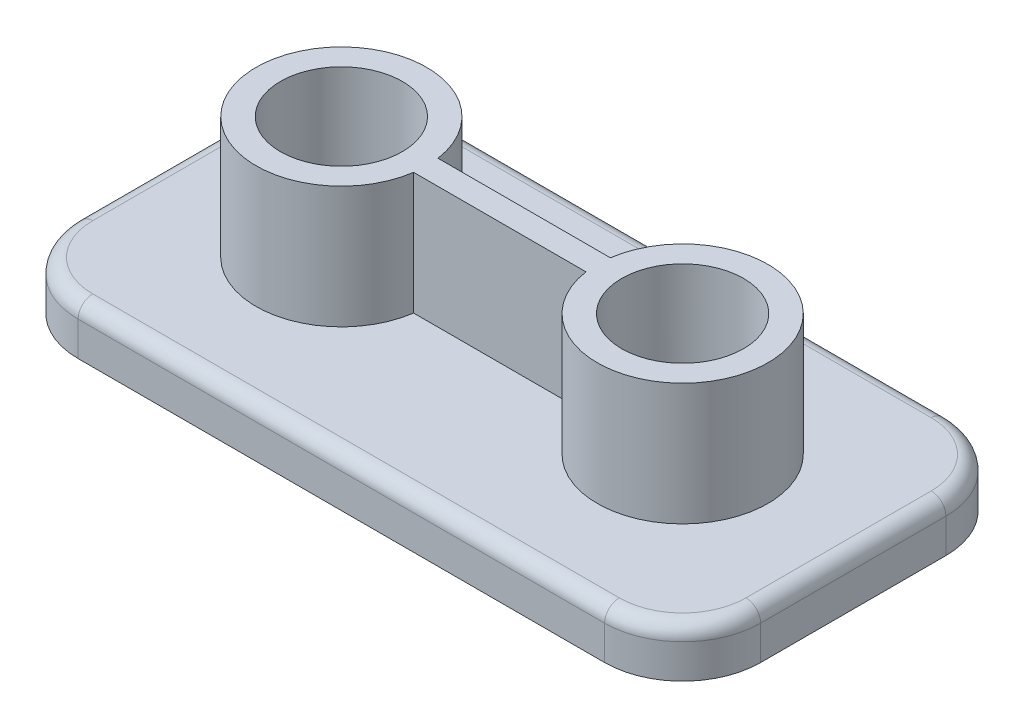
ISO-10303-21;
HEADER;
FILE_DESCRIPTION(('STEP AP214'),'2;1');
FILE_NAME('part.step','',(''),(''),'','','');
FILE_SCHEMA(('AUTOMOTIVE_DESIGN { 1 0 10303 214 1 1 1 1 }'));
ENDSEC;
DATA;
#1=APPLICATION_CONTEXT('core data for automotive mechanical design processes');
#2=APPLICATION_PROTOCOL_DEFINITION('international standard','automotive_design',2000,#1);
#3=PRODUCT_CONTEXT('',#1,'mechanical');
#4=PRODUCT('Part','Part','',(#3));
#5=PRODUCT_RELATED_PRODUCT_CATEGORY('part','',(#4));
#6=PRODUCT_DEFINITION_FORMATION('','',#4);
#7=PRODUCT_DEFINITION_CONTEXT('part definition',#1,'design');
#8=PRODUCT_DEFINITION('design','',#6,#7);
#9=PRODUCT_DEFINITION_SHAPE('','',#8);
#10=(LENGTH_UNIT() NAMED_UNIT(*) SI_UNIT(.MILLI.,.METRE.));
#11=(NAMED_UNIT(*) PLANE_ANGLE_UNIT() SI_UNIT($,.RADIAN.));
#12=(NAMED_UNIT(*) SI_UNIT($,.STERADIAN.) SOLID_ANGLE_UNIT());
#13=UNCERTAINTY_MEASURE_WITH_UNIT(LENGTH_MEASURE(1.E-05),#10,'distance_accuracy_value','');
#14=(GEOMETRIC_REPRESENTATION_CONTEXT(3) GLOBAL_UNCERTAINTY_ASSIGNED_CONTEXT((#13)) GLOBAL_UNIT_ASSIGNED_CONTEXT((#10,
#11,#12)) REPRESENTATION_CONTEXT('',''));
#15=CARTESIAN_POINT('',(0.,0.,0.));
#16=DIRECTION('',(0.,0.,1.));
#17=DIRECTION('',(1.,0.,0.));
#18=AXIS2_PLACEMENT_3D('',#15,#16,#17);
#19=CARTESIAN_POINT('',(0.,10.,0.));
#20=DIRECTION('',(0.,-1.,0.));
#21=DIRECTION('',(0.,0.,-1.));
#22=AXIS2_PLACEMENT_3D('',#19,#20,#21);
#23=PLANE('',#22);
#24=CARTESIAN_POINT('',(124.,10.,-16.));
#25=DIRECTION('',(0.,-1.,0.));
#26=DIRECTION('',(0.,0.,-1.));
#27=AXIS2_PLACEMENT_3D('',#24,#25,#26);
#28=CIRCLE('',#27,13.);
#29=CARTESIAN_POINT('',(124.,10.,-3.));
#30=VERTEX_POINT('',#29);
#31=CARTESIAN_POINT('',(137.,10.,-16.));
#32=VERTEX_POINT('',#31);
#33=EDGE_CURVE('E265',#30,#32,#28,.F.);
#34=ORIENTED_EDGE('',*,*,#33,.T.);
#35=DIRECTION('',(0.,0.,-1.));
#36=VECTOR('',#35,1.);
#37=CARTESIAN_POINT('',(137.,10.,0.));
#38=LINE('',#37,#36);
#39=CARTESIAN_POINT('',(137.,10.,-54.));
#40=VERTEX_POINT('',#39);
#41=EDGE_CURVE('E271',#32,#40,#38,.T.);
#42=ORIENTED_EDGE('',*,*,#41,.T.);
#43=CARTESIAN_POINT('',(124.,10.,-54.));
#44=DIRECTION('',(0.,-1.,0.));
#45=DIRECTION('',(0.,0.,-1.));
#46=AXIS2_PLACEMENT_3D('',#43,#44,#45);
#47=CIRCLE('',#46,13.);
#48=CARTESIAN_POINT('',(124.,10.,-67.));
#49=VERTEX_POINT('',#48);
#50=EDGE_CURVE('E268',#40,#49,#47,.F.);
#51=ORIENTED_EDGE('',*,*,#50,.T.);
#52=DIRECTION('',(-1.,0.,0.));
#53=VECTOR('',#52,1.);
#54=CARTESIAN_POINT('',(0.,10.,-67.));
#55=LINE('',#54,#53);
#56=CARTESIAN_POINT('',(16.,10.,-67.));
#57=VERTEX_POINT('',#56);
#58=EDGE_CURVE('E262',#49,#57,#55,.T.);
#59=ORIENTED_EDGE('',*,*,#58,.T.);
#60=CARTESIAN_POINT('',(16.,10.,-54.));
#61=DIRECTION('',(0.,-1.,0.));
#62=DIRECTION('',(0.,0.,-1.));
#63=AXIS2_PLACEMENT_3D('',#60,#61,#62);
#64=CIRCLE('',#63,13.);
#65=CARTESIAN_POINT('',(3.,10.,-54.));
#66=VERTEX_POINT('',#65);
#67=EDGE_CURVE('E255',#57,#66,#64,.F.);
#68=ORIENTED_EDGE('',*,*,#67,.T.);
#69=DIRECTION('',(0.,0.,1.));
#70=VECTOR('',#69,1.);
#71=CARTESIAN_POINT('',(3.,10.,0.));
#72=LINE('',#71,#70);
#73=CARTESIAN_POINT('',(3.,10.,-16.));
#74=VERTEX_POINT('',#73);
#75=EDGE_CURVE('E249',#66,#74,#72,.T.);
#76=ORIENTED_EDGE('',*,*,#75,.T.);
#77=CARTESIAN_POINT('',(16.,10.,-16.));
#78=DIRECTION('',(0.,-1.,0.));
#79=DIRECTION('',(0.,0.,-1.));
#80=AXIS2_PLACEMENT_3D('',#77,#78,#79);
#81=CIRCLE('',#80,13.);
#82=CARTESIAN_POINT('',(16.,10.,-3.));
#83=VERTEX_POINT('',#82);
#84=EDGE_CURVE('E252',#74,#83,#81,.F.);
#85=ORIENTED_EDGE('',*,*,#84,.T.);
#86=DIRECTION('',(1.,0.,0.));
#87=VECTOR('',#86,1.);
#88=CARTESIAN_POINT('',(0.,10.,-3.));
#89=LINE('',#88,#87);
#90=EDGE_CURVE('E259',#83,#30,#89,.T.);
#91=ORIENTED_EDGE('',*,*,#90,.T.);
#92=EDGE_LOOP('',(#34,#42,#51,#59,#68,#76,#85,#91));
#93=FACE_BOUND('',#92,.T.);
#94=CARTESIAN_POINT('',(105.,10.,-35.));
#95=DIRECTION('',(0.,1.,0.));
#96=DIRECTION('',(0.,0.,1.));
#97=AXIS2_PLACEMENT_3D('',#94,#95,#96);
#98=CIRCLE('',#97,17.5);
#99=CARTESIAN_POINT('',(87.6794919243112,10.,-32.5));
#100=VERTEX_POINT('',#99);
#101=CARTESIAN_POINT('',(87.6794919243112,10.,-37.5));
#102=VERTEX_POINT('',#101);
#103=EDGE_CURVE('E182',#100,#102,#98,.T.);
#104=ORIENTED_EDGE('',*,*,#103,.F.);
#105=DIRECTION('',(-1.,0.,0.));
#106=VECTOR('',#105,1.);
#107=CARTESIAN_POINT('',(0.,10.,-32.5));
#108=LINE('',#107,#106);
#109=CARTESIAN_POINT('',(52.3205080756888,10.,-32.5));
#110=VERTEX_POINT('',#109);
#111=EDGE_CURVE('E339',#100,#110,#108,.T.);
#112=ORIENTED_EDGE('',*,*,#111,.T.);
#113=CARTESIAN_POINT('',(35.,10.,-35.));
#114=DIRECTION('',(0.,1.,0.));
#115=DIRECTION('',(0.,0.,1.));
#116=AXIS2_PLACEMENT_3D('',#113,#114,#115);
#117=CIRCLE('',#116,17.5);
#118=CARTESIAN_POINT('',(52.3205080756888,10.,-37.5));
#119=VERTEX_POINT('',#118);
#120=EDGE_CURVE('E331',#119,#110,#117,.T.);
#121=ORIENTED_EDGE('',*,*,#120,.F.);
#122=DIRECTION('',(-1.,0.,0.));
#123=VECTOR('',#122,1.);
#124=CARTESIAN_POINT('',(0.,10.,-37.5));
#125=LINE('',#124,#123);
#126=EDGE_CURVE('E328',#102,#119,#125,.T.);
#127=ORIENTED_EDGE('',*,*,#126,.F.);
#128=EDGE_LOOP('',(#104,#112,#121,#127));
#129=FACE_BOUND('',#128,.T.);
#130=ADVANCED_FACE('F41',(#93,#129),#23,.F.);
#131=CARTESIAN_POINT('',(0.,10.,0.));
#132=DIRECTION('',(1.,0.,0.));
#133=DIRECTION('',(0.,0.,-1.));
#134=AXIS2_PLACEMENT_3D('',#131,#132,#133);
#135=PLANE('',#134);
#136=DIRECTION('',(0.,-1.,0.));
#137=VECTOR('',#136,1.);
#138=CARTESIAN_POINT('',(0.,10.,-16.));
#139=LINE('',#138,#137);
#140=CARTESIAN_POINT('',(0.,0.,-16.));
#141=VERTEX_POINT('',#140);
#142=CARTESIAN_POINT('',(0.,7.,-16.));
#143=VERTEX_POINT('',#142);
#144=EDGE_CURVE('E211',#141,#143,#139,.F.);
#145=ORIENTED_EDGE('',*,*,#144,.T.);
#146=DIRECTION('',(0.,0.,1.));
#147=VECTOR('',#146,1.);
#148=CARTESIAN_POINT('',(0.,7.,0.));
#149=LINE('',#148,#147);
#150=CARTESIAN_POINT('',(0.,7.,-54.));
#151=VERTEX_POINT('',#150);
#152=EDGE_CURVE('E11',#143,#151,#149,.F.);
#153=ORIENTED_EDGE('',*,*,#152,.T.);
#154=DIRECTION('',(0.,-1.,0.));
#155=VECTOR('',#154,1.);
#156=CARTESIAN_POINT('',(0.,10.,-54.));
#157=LINE('',#156,#155);
#158=CARTESIAN_POINT('',(0.,0.,-54.));
#159=VERTEX_POINT('',#158);
#160=EDGE_CURVE('E214',#151,#159,#157,.T.);
#161=ORIENTED_EDGE('',*,*,#160,.T.);
#162=DIRECTION('',(0.,0.,1.));
#163=VECTOR('',#162,1.);
#164=CARTESIAN_POINT('',(0.,0.,0.));
#165=LINE('',#164,#163);
#166=EDGE_CURVE('E185',#159,#141,#165,.T.);
#167=ORIENTED_EDGE('',*,*,#166,.T.);
#168=EDGE_LOOP('',(#145,#153,#161,#167));
#169=FACE_BOUND('',#168,.T.);
#170=ADVANCED_FACE('F392',(#169),#135,.F.);
#171=CARTESIAN_POINT('',(0.,10.,0.));
#172=DIRECTION('',(0.,0.,-1.));
#173=DIRECTION('',(-1.,0.,0.));
#174=AXIS2_PLACEMENT_3D('',#171,#172,#173);
#175=PLANE('',#174);
#176=DIRECTION('',(0.,-1.,0.));
#177=VECTOR('',#176,1.);
#178=CARTESIAN_POINT('',(124.,10.,0.));
#179=LINE('',#178,#177);
#180=CARTESIAN_POINT('',(124.,0.,0.));
#181=VERTEX_POINT('',#180);
#182=CARTESIAN_POINT('',(124.,7.,0.));
#183=VERTEX_POINT('',#182);
#184=EDGE_CURVE('E246',#181,#183,#179,.F.);
#185=ORIENTED_EDGE('',*,*,#184,.T.);
#186=DIRECTION('',(1.,0.,0.));
#187=VECTOR('',#186,1.);
#188=CARTESIAN_POINT('',(0.,7.,0.));
#189=LINE('',#188,#187);
#190=CARTESIAN_POINT('',(16.,7.,0.));
#191=VERTEX_POINT('',#190);
#192=EDGE_CURVE('E51',#183,#191,#189,.F.);
#193=ORIENTED_EDGE('',*,*,#192,.T.);
#194=DIRECTION('',(0.,-1.,0.));
#195=VECTOR('',#194,1.);
#196=CARTESIAN_POINT('',(16.,10.,0.));
#197=LINE('',#196,#195);
#198=CARTESIAN_POINT('',(16.,0.,0.));
#199=VERTEX_POINT('',#198);
#200=EDGE_CURVE('E243',#191,#199,#197,.T.);
#201=ORIENTED_EDGE('',*,*,#200,.T.);
#202=DIRECTION('',(1.,0.,0.));
#203=VECTOR('',#202,1.);
#204=CARTESIAN_POINT('',(0.,0.,0.));
#205=LINE('',#204,#203);
#206=EDGE_CURVE('E190',#199,#181,#205,.T.);
#207=ORIENTED_EDGE('',*,*,#206,.T.);
#208=EDGE_LOOP('',(#185,#193,#201,#207));
#209=FACE_BOUND('',#208,.T.);
#210=ADVANCED_FACE('F397',(#209),#175,.F.);
#211=CARTESIAN_POINT('',(140.,10.,0.));
#212=DIRECTION('',(-1.,0.,0.));
#213=DIRECTION('',(0.,0.,1.));
#214=AXIS2_PLACEMENT_3D('',#211,#212,#213);
#215=PLANE('',#214);
#216=DIRECTION('',(0.,-1.,0.));
#217=VECTOR('',#216,1.);
#218=CARTESIAN_POINT('',(140.,10.,-54.));
#219=LINE('',#218,#217);
#220=CARTESIAN_POINT('',(140.,0.,-54.));
#221=VERTEX_POINT('',#220);
#222=CARTESIAN_POINT('',(140.,7.,-54.));
#223=VERTEX_POINT('',#222);
#224=EDGE_CURVE('E239',#221,#223,#219,.F.);
#225=ORIENTED_EDGE('',*,*,#224,.T.);
#226=DIRECTION('',(0.,0.,-1.));
#227=VECTOR('',#226,1.);
#228=CARTESIAN_POINT('',(140.,7.,0.));
#229=LINE('',#228,#227);
#230=CARTESIAN_POINT('',(140.,7.,-16.));
#231=VERTEX_POINT('',#230);
#232=EDGE_CURVE('E289',#223,#231,#229,.F.);
#233=ORIENTED_EDGE('',*,*,#232,.T.);
#234=DIRECTION('',(0.,-1.,0.));
#235=VECTOR('',#234,1.);
#236=CARTESIAN_POINT('',(140.,10.,-16.));
#237=LINE('',#236,#235);
#238=CARTESIAN_POINT('',(140.,0.,-16.));
#239=VERTEX_POINT('',#238);
#240=EDGE_CURVE('E236',#231,#239,#237,.T.);
#241=ORIENTED_EDGE('',*,*,#240,.T.);
#242=DIRECTION('',(0.,0.,-1.));
#243=VECTOR('',#242,1.);
#244=CARTESIAN_POINT('',(140.,0.,0.));
#245=LINE('',#244,#243);
#246=EDGE_CURVE('E199',#239,#221,#245,.T.);
#247=ORIENTED_EDGE('',*,*,#246,.T.);
#248=EDGE_LOOP('',(#225,#233,#241,#247));
#249=FACE_BOUND('',#248,.T.);
#250=ADVANCED_FACE('F462',(#249),#215,.F.);
#251=CARTESIAN_POINT('',(0.,10.,-70.));
#252=DIRECTION('',(0.,0.,1.));
#253=DIRECTION('',(1.,0.,0.));
#254=AXIS2_PLACEMENT_3D('',#251,#252,#253);
#255=PLANE('',#254);
#256=DIRECTION('',(0.,-1.,0.));
#257=VECTOR('',#256,1.);
#258=CARTESIAN_POINT('',(16.,10.,-70.));
#259=LINE('',#258,#257);
#260=CARTESIAN_POINT('',(16.,0.,-70.));
#261=VERTEX_POINT('',#260);
#262=CARTESIAN_POINT('',(16.,7.,-70.));
#263=VERTEX_POINT('',#262);
#264=EDGE_CURVE('E232',#261,#263,#259,.F.);
#265=ORIENTED_EDGE('',*,*,#264,.T.);
#266=DIRECTION('',(-1.,0.,0.));
#267=VECTOR('',#266,1.);
#268=CARTESIAN_POINT('',(0.,7.,-70.));
#269=LINE('',#268,#267);
#270=CARTESIAN_POINT('',(124.,7.,-70.));
#271=VERTEX_POINT('',#270);
#272=EDGE_CURVE('E286',#263,#271,#269,.F.);
#273=ORIENTED_EDGE('',*,*,#272,.T.);
#274=DIRECTION('',(0.,-1.,0.));
#275=VECTOR('',#274,1.);
#276=CARTESIAN_POINT('',(124.,10.,-70.));
#277=LINE('',#276,#275);
#278=CARTESIAN_POINT('',(124.,0.,-70.));
#279=VERTEX_POINT('',#278);
#280=EDGE_CURVE('E229',#271,#279,#277,.T.);
#281=ORIENTED_EDGE('',*,*,#280,.T.);
#282=DIRECTION('',(-1.,0.,0.));
#283=VECTOR('',#282,1.);
#284=CARTESIAN_POINT('',(0.,0.,-70.));
#285=LINE('',#284,#283);
#286=EDGE_CURVE('E203',#279,#261,#285,.T.);
#287=ORIENTED_EDGE('',*,*,#286,.T.);
#288=EDGE_LOOP('',(#265,#273,#281,#287));
#289=FACE_BOUND('',#288,.T.);
#290=ADVANCED_FACE('F465',(#289),#255,.F.);
#291=CARTESIAN_POINT('',(0.,0.,0.));
#292=DIRECTION('',(0.,-1.,0.));
#293=DIRECTION('',(0.,0.,-1.));
#294=AXIS2_PLACEMENT_3D('',#291,#292,#293);
#295=PLANE('',#294);
#296=ORIENTED_EDGE('',*,*,#166,.F.);
#297=CARTESIAN_POINT('',(16.,0.,-54.));
#298=DIRECTION('',(0.,-1.,0.));
#299=DIRECTION('',(0.,0.,-1.));
#300=AXIS2_PLACEMENT_3D('',#297,#298,#299);
#301=CIRCLE('',#300,16.);
#302=EDGE_CURVE('E226',#159,#261,#301,.T.);
#303=ORIENTED_EDGE('',*,*,#302,.T.);
#304=ORIENTED_EDGE('',*,*,#286,.F.);
#305=CARTESIAN_POINT('',(124.,0.,-54.));
#306=DIRECTION('',(0.,-1.,0.));
#307=DIRECTION('',(0.,0.,-1.));
#308=AXIS2_PLACEMENT_3D('',#305,#306,#307);
#309=CIRCLE('',#308,16.);
#310=EDGE_CURVE('E223',#279,#221,#309,.T.);
#311=ORIENTED_EDGE('',*,*,#310,.T.);
#312=ORIENTED_EDGE('',*,*,#246,.F.);
#313=CARTESIAN_POINT('',(124.,0.,-16.));
#314=DIRECTION('',(0.,-1.,0.));
#315=DIRECTION('',(0.,0.,-1.));
#316=AXIS2_PLACEMENT_3D('',#313,#314,#315);
#317=CIRCLE('',#316,16.);
#318=EDGE_CURVE('E220',#239,#181,#317,.T.);
#319=ORIENTED_EDGE('',*,*,#318,.T.);
#320=ORIENTED_EDGE('',*,*,#206,.F.);
#321=CARTESIAN_POINT('',(16.,0.,-16.));
#322=DIRECTION('',(0.,-1.,0.));
#323=DIRECTION('',(0.,0.,-1.));
#324=AXIS2_PLACEMENT_3D('',#321,#322,#323);
#325=CIRCLE('',#324,16.);
#326=EDGE_CURVE('E217',#199,#141,#325,.T.);
#327=ORIENTED_EDGE('',*,*,#326,.T.);
#328=EDGE_LOOP('',(#296,#303,#304,#311,#312,#319,#320,#327));
#329=FACE_BOUND('',#328,.T.);
#330=ADVANCED_FACE('F468',(#329),#295,.T.);
#331=CARTESIAN_POINT('',(105.,35.,-35.));
#332=DIRECTION('',(0.,-1.,0.));
#333=DIRECTION('',(0.,0.,-1.));
#334=AXIS2_PLACEMENT_3D('',#331,#332,#333);
#335=CYLINDRICAL_SURFACE('',#334,17.5);
#336=ORIENTED_EDGE('',*,*,#103,.T.);
#337=DIRECTION('',(0.,-1.,0.));
#338=VECTOR('',#337,1.);
#339=CARTESIAN_POINT('',(87.6794919243112,35.,-37.5));
#340=LINE('',#339,#338);
#341=CARTESIAN_POINT('',(87.6794919243112,35.,-37.5));
#342=VERTEX_POINT('',#341);
#343=EDGE_CURVE('E160',#342,#102,#340,.T.);
#344=ORIENTED_EDGE('',*,*,#343,.F.);
#345=CARTESIAN_POINT('',(105.,35.,-35.));
#346=DIRECTION('',(0.,1.,0.));
#347=DIRECTION('',(0.,0.,1.));
#348=AXIS2_PLACEMENT_3D('',#345,#346,#347);
#349=CIRCLE('',#348,17.5);
#350=CARTESIAN_POINT('',(87.6794919243112,35.,-32.5));
#351=VERTEX_POINT('',#350);
#352=EDGE_CURVE('E168',#351,#342,#349,.T.);
#353=ORIENTED_EDGE('',*,*,#352,.F.);
#354=DIRECTION('',(0.,-1.,0.));
#355=VECTOR('',#354,1.);
#356=CARTESIAN_POINT('',(87.6794919243112,35.,-32.5));
#357=LINE('',#356,#355);
#358=EDGE_CURVE('E346',#351,#100,#357,.T.);
#359=ORIENTED_EDGE('',*,*,#358,.T.);
#360=EDGE_LOOP('',(#336,#344,#353,#359));
#361=FACE_BOUND('',#360,.T.);
#362=ADVANCED_FACE('F180',(#361),#335,.T.);
#363=CARTESIAN_POINT('',(0.,35.,-37.5));
#364=DIRECTION('',(0.,0.,1.));
#365=DIRECTION('',(1.,0.,0.));
#366=AXIS2_PLACEMENT_3D('',#363,#364,#365);
#367=PLANE('',#366);
#368=ORIENTED_EDGE('',*,*,#126,.T.);
#369=DIRECTION('',(0.,-1.,0.));
#370=VECTOR('',#369,1.);
#371=CARTESIAN_POINT('',(52.3205080756888,35.,-37.5));
#372=LINE('',#371,#370);
#373=CARTESIAN_POINT('',(52.3205080756888,35.,-37.5));
#374=VERTEX_POINT('',#373);
#375=EDGE_CURVE('E163',#374,#119,#372,.T.);
#376=ORIENTED_EDGE('',*,*,#375,.F.);
#377=DIRECTION('',(-1.,0.,0.));
#378=VECTOR('',#377,1.);
#379=CARTESIAN_POINT('',(0.,35.,-37.5));
#380=LINE('',#379,#378);
#381=EDGE_CURVE('E156',#342,#374,#380,.T.);
#382=ORIENTED_EDGE('',*,*,#381,.F.);
#383=ORIENTED_EDGE('',*,*,#343,.T.);
#384=EDGE_LOOP('',(#368,#376,#382,#383));
#385=FACE_BOUND('',#384,.T.);
#386=ADVANCED_FACE('F158',(#385),#367,.F.);
#387=CARTESIAN_POINT('',(35.,35.,-35.));
#388=DIRECTION('',(0.,-1.,0.));
#389=DIRECTION('',(0.,0.,-1.));
#390=AXIS2_PLACEMENT_3D('',#387,#388,#389);
#391=CYLINDRICAL_SURFACE('',#390,17.5);
#392=ORIENTED_EDGE('',*,*,#120,.T.);
#393=DIRECTION('',(0.,-1.,0.));
#394=VECTOR('',#393,1.);
#395=CARTESIAN_POINT('',(52.3205080756888,35.,-32.5));
#396=LINE('',#395,#394);
#397=CARTESIAN_POINT('',(52.3205080756888,35.,-32.5));
#398=VERTEX_POINT('',#397);
#399=EDGE_CURVE('E192',#398,#110,#396,.T.);
#400=ORIENTED_EDGE('',*,*,#399,.F.);
#401=CARTESIAN_POINT('',(35.,35.,-35.));
#402=DIRECTION('',(0.,1.,0.));
#403=DIRECTION('',(0.,0.,1.));
#404=AXIS2_PLACEMENT_3D('',#401,#402,#403);
#405=CIRCLE('',#404,17.5);
#406=EDGE_CURVE('E167',#374,#398,#405,.T.);
#407=ORIENTED_EDGE('',*,*,#406,.F.);
#408=ORIENTED_EDGE('',*,*,#375,.T.);
#409=EDGE_LOOP('',(#392,#400,#407,#408));
#410=FACE_BOUND('',#409,.T.);
#411=ADVANCED_FACE('F357',(#410),#391,.T.);
#412=CARTESIAN_POINT('',(35.,35.,-35.));
#413=DIRECTION('',(0.,-1.,0.));
#414=DIRECTION('',(0.,0.,-1.));
#415=AXIS2_PLACEMENT_3D('',#412,#413,#414);
#416=CYLINDRICAL_SURFACE('',#415,12.5);
#417=CARTESIAN_POINT('',(35.,35.,-35.));
#418=DIRECTION('',(0.,1.,0.));
#419=DIRECTION('',(0.,0.,1.));
#420=AXIS2_PLACEMENT_3D('',#417,#418,#419);
#421=CIRCLE('',#420,12.5);
#422=CARTESIAN_POINT('',(35.,35.,-22.5));
#423=VERTEX_POINT('',#422);
#424=EDGE_CURVE('E361',#423,#423,#421,.T.);
#425=ORIENTED_EDGE('',*,*,#424,.T.);
#426=EDGE_LOOP('',(#425));
#427=FACE_BOUND('',#426,.T.);
#428=CARTESIAN_POINT('',(35.,10.,-35.));
#429=DIRECTION('',(0.,1.,0.));
#430=DIRECTION('',(0.,0.,1.));
#431=AXIS2_PLACEMENT_3D('',#428,#429,#430);
#432=CIRCLE('',#431,12.5);
#433=CARTESIAN_POINT('',(35.,10.,-22.5));
#434=VERTEX_POINT('',#433);
#435=EDGE_CURVE('E178',#434,#434,#432,.T.);
#436=ORIENTED_EDGE('',*,*,#435,.F.);
#437=EDGE_LOOP('',(#436));
#438=FACE_BOUND('',#437,.T.);
#439=ADVANCED_FACE('F496',(#427,#438),#416,.F.);
#440=CARTESIAN_POINT('',(0.,35.,-32.5));
#441=DIRECTION('',(0.,0.,1.));
#442=DIRECTION('',(1.,0.,0.));
#443=AXIS2_PLACEMENT_3D('',#440,#441,#442);
#444=PLANE('',#443);
#445=ORIENTED_EDGE('',*,*,#111,.F.);
#446=ORIENTED_EDGE('',*,*,#358,.F.);
#447=DIRECTION('',(-1.,0.,0.));
#448=VECTOR('',#447,1.);
#449=CARTESIAN_POINT('',(0.,35.,-32.5));
#450=LINE('',#449,#448);
#451=EDGE_CURVE('E175',#351,#398,#450,.T.);
#452=ORIENTED_EDGE('',*,*,#451,.T.);
#453=ORIENTED_EDGE('',*,*,#399,.T.);
#454=EDGE_LOOP('',(#445,#446,#452,#453));
#455=FACE_BOUND('',#454,.T.);
#456=ADVANCED_FACE('F353',(#455),#444,.T.);
#457=CARTESIAN_POINT('',(105.,35.,-35.));
#458=DIRECTION('',(0.,-1.,0.));
#459=DIRECTION('',(0.,0.,-1.));
#460=AXIS2_PLACEMENT_3D('',#457,#458,#459);
#461=CYLINDRICAL_SURFACE('',#460,12.5);
#462=CARTESIAN_POINT('',(105.,35.,-35.));
#463=DIRECTION('',(0.,1.,0.));
#464=DIRECTION('',(0.,0.,1.));
#465=AXIS2_PLACEMENT_3D('',#462,#463,#464);
#466=CIRCLE('',#465,12.5);
#467=CARTESIAN_POINT('',(105.,35.,-22.5));
#468=VERTEX_POINT('',#467);
#469=EDGE_CURVE('E334',#468,#468,#466,.F.);
#470=ORIENTED_EDGE('',*,*,#469,.F.);
#471=EDGE_LOOP('',(#470));
#472=FACE_BOUND('',#471,.T.);
#473=CARTESIAN_POINT('',(105.,10.,-35.));
#474=DIRECTION('',(0.,-1.,0.));
#475=DIRECTION('',(0.,0.,-1.));
#476=AXIS2_PLACEMENT_3D('',#473,#474,#475);
#477=CIRCLE('',#476,12.5);
#478=CARTESIAN_POINT('',(105.,10.,-47.5));
#479=VERTEX_POINT('',#478);
#480=EDGE_CURVE('E207',#479,#479,#477,.T.);
#481=ORIENTED_EDGE('',*,*,#480,.T.);
#482=EDGE_LOOP('',(#481));
#483=FACE_BOUND('',#482,.T.);
#484=ADVANCED_FACE('F372',(#472,#483),#461,.F.);
#485=CARTESIAN_POINT('',(0.,35.,0.));
#486=DIRECTION('',(0.,1.,0.));
#487=DIRECTION('',(0.,0.,1.));
#488=AXIS2_PLACEMENT_3D('',#485,#486,#487);
#489=PLANE('',#488);
#490=ORIENTED_EDGE('',*,*,#352,.T.);
#491=ORIENTED_EDGE('',*,*,#381,.T.);
#492=ORIENTED_EDGE('',*,*,#406,.T.);
#493=ORIENTED_EDGE('',*,*,#451,.F.);
#494=EDGE_LOOP('',(#490,#491,#492,#493));
#495=FACE_BOUND('',#494,.T.);
#496=ORIENTED_EDGE('',*,*,#424,.F.);
#497=EDGE_LOOP('',(#496));
#498=FACE_BOUND('',#497,.T.);
#499=ORIENTED_EDGE('',*,*,#469,.T.);
#500=EDGE_LOOP('',(#499));
#501=FACE_BOUND('',#500,.T.);
#502=ADVANCED_FACE('F172',(#495,#498,#501),#489,.T.);
#503=ORIENTED_EDGE('',*,*,#480,.F.);
#504=EDGE_LOOP('',(#503));
#505=FACE_BOUND('',#504,.T.);
#506=ADVANCED_FACE('F378',(#505),#23,.F.);
#507=ORIENTED_EDGE('',*,*,#435,.T.);
#508=EDGE_LOOP('',(#507));
#509=FACE_BOUND('',#508,.T.);
#510=ADVANCED_FACE('F380',(#509),#23,.F.);
#511=CARTESIAN_POINT('',(16.,10.,-54.));
#512=DIRECTION('',(0.,-1.,0.));
#513=DIRECTION('',(0.,0.,-1.));
#514=AXIS2_PLACEMENT_3D('',#511,#512,#513);
#515=CYLINDRICAL_SURFACE('',#514,16.);
#516=ORIENTED_EDGE('',*,*,#160,.F.);
#517=CARTESIAN_POINT('',(16.,7.,-54.));
#518=DIRECTION('',(0.,-1.,0.));
#519=DIRECTION('',(0.,0.,-1.));
#520=AXIS2_PLACEMENT_3D('',#517,#518,#519);
#521=CIRCLE('',#520,16.);
#522=EDGE_CURVE('E274',#151,#263,#521,.T.);
#523=ORIENTED_EDGE('',*,*,#522,.T.);
#524=ORIENTED_EDGE('',*,*,#264,.F.);
#525=ORIENTED_EDGE('',*,*,#302,.F.);
#526=EDGE_LOOP('',(#516,#523,#524,#525));
#527=FACE_BOUND('',#526,.T.);
#528=ADVANCED_FACE('F386',(#527),#515,.T.);
#529=CARTESIAN_POINT('',(124.,10.,-54.));
#530=DIRECTION('',(0.,-1.,0.));
#531=DIRECTION('',(0.,0.,-1.));
#532=AXIS2_PLACEMENT_3D('',#529,#530,#531);
#533=CYLINDRICAL_SURFACE('',#532,16.);
#534=ORIENTED_EDGE('',*,*,#280,.F.);
#535=CARTESIAN_POINT('',(124.,7.,-54.));
#536=DIRECTION('',(0.,-1.,0.));
#537=DIRECTION('',(0.,0.,-1.));
#538=AXIS2_PLACEMENT_3D('',#535,#536,#537);
#539=CIRCLE('',#538,16.);
#540=EDGE_CURVE('E278',#271,#223,#539,.T.);
#541=ORIENTED_EDGE('',*,*,#540,.T.);
#542=ORIENTED_EDGE('',*,*,#224,.F.);
#543=ORIENTED_EDGE('',*,*,#310,.F.);
#544=EDGE_LOOP('',(#534,#541,#542,#543));
#545=FACE_BOUND('',#544,.T.);
#546=ADVANCED_FACE('F452',(#545),#533,.T.);
#547=CARTESIAN_POINT('',(124.,10.,-16.));
#548=DIRECTION('',(0.,-1.,0.));
#549=DIRECTION('',(0.,0.,-1.));
#550=AXIS2_PLACEMENT_3D('',#547,#548,#549);
#551=CYLINDRICAL_SURFACE('',#550,16.);
#552=ORIENTED_EDGE('',*,*,#240,.F.);
#553=CARTESIAN_POINT('',(124.,7.,-16.));
#554=DIRECTION('',(0.,-1.,0.));
#555=DIRECTION('',(0.,0.,-1.));
#556=AXIS2_PLACEMENT_3D('',#553,#554,#555);
#557=CIRCLE('',#556,16.);
#558=EDGE_CURVE('E281',#231,#183,#557,.T.);
#559=ORIENTED_EDGE('',*,*,#558,.T.);
#560=ORIENTED_EDGE('',*,*,#184,.F.);
#561=ORIENTED_EDGE('',*,*,#318,.F.);
#562=EDGE_LOOP('',(#552,#559,#560,#561));
#563=FACE_BOUND('',#562,.T.);
#564=ADVANCED_FACE('F449',(#563),#551,.T.);
#565=CARTESIAN_POINT('',(16.,10.,-16.));
#566=DIRECTION('',(0.,-1.,0.));
#567=DIRECTION('',(0.,0.,-1.));
#568=AXIS2_PLACEMENT_3D('',#565,#566,#567);
#569=CYLINDRICAL_SURFACE('',#568,16.);
#570=ORIENTED_EDGE('',*,*,#200,.F.);
#571=CARTESIAN_POINT('',(16.,7.,-16.));
#572=DIRECTION('',(0.,-1.,0.));
#573=DIRECTION('',(0.,0.,-1.));
#574=AXIS2_PLACEMENT_3D('',#571,#572,#573);
#575=CIRCLE('',#574,16.);
#576=EDGE_CURVE('E65',#191,#143,#575,.T.);
#577=ORIENTED_EDGE('',*,*,#576,.T.);
#578=ORIENTED_EDGE('',*,*,#144,.F.);
#579=ORIENTED_EDGE('',*,*,#326,.F.);
#580=EDGE_LOOP('',(#570,#577,#578,#579));
#581=FACE_BOUND('',#580,.T.);
#582=ADVANCED_FACE('F446',(#581),#569,.T.);
#583=CARTESIAN_POINT('',(124.,7.,-16.));
#584=DIRECTION('',(0.,-1.,0.));
#585=DIRECTION('',(0.,0.,-1.));
#586=AXIS2_PLACEMENT_3D('',#583,#584,#585);
#587=TOROIDAL_SURFACE('',#586,13.,3.);
#588=CARTESIAN_POINT('',(124.,7.,-3.));
#589=DIRECTION('',(-1.,0.,0.));
#590=DIRECTION('',(0.,0.,1.));
#591=AXIS2_PLACEMENT_3D('',#588,#589,#590);
#592=CIRCLE('',#591,3.);
#593=EDGE_CURVE('E315',#183,#30,#592,.T.);
#594=ORIENTED_EDGE('',*,*,#593,.F.);
#595=ORIENTED_EDGE('',*,*,#558,.F.);
#596=CARTESIAN_POINT('',(137.,7.,-16.));
#597=DIRECTION('',(0.,0.,-1.));
#598=DIRECTION('',(-1.,0.,0.));
#599=AXIS2_PLACEMENT_3D('',#596,#597,#598);
#600=CIRCLE('',#599,3.);
#601=EDGE_CURVE('E45',#32,#231,#600,.T.);
#602=ORIENTED_EDGE('',*,*,#601,.F.);
#603=ORIENTED_EDGE('',*,*,#33,.F.);
#604=EDGE_LOOP('',(#594,#595,#602,#603));
#605=FACE_BOUND('',#604,.T.);
#606=ADVANCED_FACE('F43',(#605),#587,.T.);
#607=CARTESIAN_POINT('',(137.,7.,0.));
#608=DIRECTION('',(0.,0.,-1.));
#609=DIRECTION('',(-1.,0.,0.));
#610=AXIS2_PLACEMENT_3D('',#607,#608,#609);
#611=CYLINDRICAL_SURFACE('',#610,3.);
#612=ORIENTED_EDGE('',*,*,#601,.T.);
#613=ORIENTED_EDGE('',*,*,#232,.F.);
#614=CARTESIAN_POINT('',(137.,7.,-54.));
#615=DIRECTION('',(0.,0.,-1.));
#616=DIRECTION('',(-1.,0.,0.));
#617=AXIS2_PLACEMENT_3D('',#614,#615,#616);
#618=CIRCLE('',#617,3.);
#619=EDGE_CURVE('E312',#40,#223,#618,.T.);
#620=ORIENTED_EDGE('',*,*,#619,.F.);
#621=ORIENTED_EDGE('',*,*,#41,.F.);
#622=EDGE_LOOP('',(#612,#613,#620,#621));
#623=FACE_BOUND('',#622,.T.);
#624=ADVANCED_FACE('F404',(#623),#611,.T.);
#625=CARTESIAN_POINT('',(0.,7.,-3.));
#626=DIRECTION('',(1.,0.,0.));
#627=DIRECTION('',(0.,0.,-1.));
#628=AXIS2_PLACEMENT_3D('',#625,#626,#627);
#629=CYLINDRICAL_SURFACE('',#628,3.);
#630=ORIENTED_EDGE('',*,*,#593,.T.);
#631=ORIENTED_EDGE('',*,*,#90,.F.);
#632=CARTESIAN_POINT('',(16.,7.,-3.));
#633=DIRECTION('',(-1.,0.,0.));
#634=DIRECTION('',(0.,0.,1.));
#635=AXIS2_PLACEMENT_3D('',#632,#633,#634);
#636=CIRCLE('',#635,3.);
#637=EDGE_CURVE('E308',#191,#83,#636,.T.);
#638=ORIENTED_EDGE('',*,*,#637,.F.);
#639=ORIENTED_EDGE('',*,*,#192,.F.);
#640=EDGE_LOOP('',(#630,#631,#638,#639));
#641=FACE_BOUND('',#640,.T.);
#642=ADVANCED_FACE('F429',(#641),#629,.T.);
#643=CARTESIAN_POINT('',(124.,7.,-54.));
#644=DIRECTION('',(0.,-1.,0.));
#645=DIRECTION('',(0.,0.,-1.));
#646=AXIS2_PLACEMENT_3D('',#643,#644,#645);
#647=TOROIDAL_SURFACE('',#646,13.,3.);
#648=ORIENTED_EDGE('',*,*,#619,.T.);
#649=ORIENTED_EDGE('',*,*,#540,.F.);
#650=CARTESIAN_POINT('',(124.,7.,-67.));
#651=DIRECTION('',(-1.,0.,0.));
#652=DIRECTION('',(0.,0.,1.));
#653=AXIS2_PLACEMENT_3D('',#650,#651,#652);
#654=CIRCLE('',#653,3.);
#655=EDGE_CURVE('E304',#49,#271,#654,.T.);
#656=ORIENTED_EDGE('',*,*,#655,.F.);
#657=ORIENTED_EDGE('',*,*,#50,.F.);
#658=EDGE_LOOP('',(#648,#649,#656,#657));
#659=FACE_BOUND('',#658,.T.);
#660=ADVANCED_FACE('F409',(#659),#647,.T.);
#661=CARTESIAN_POINT('',(16.,7.,-16.));
#662=DIRECTION('',(0.,-1.,0.));
#663=DIRECTION('',(0.,0.,-1.));
#664=AXIS2_PLACEMENT_3D('',#661,#662,#663);
#665=TOROIDAL_SURFACE('',#664,13.,3.);
#666=ORIENTED_EDGE('',*,*,#637,.T.);
#667=ORIENTED_EDGE('',*,*,#84,.F.);
#668=CARTESIAN_POINT('',(3.,7.,-16.));
#669=DIRECTION('',(0.,0.,-1.));
#670=DIRECTION('',(-1.,0.,0.));
#671=AXIS2_PLACEMENT_3D('',#668,#669,#670);
#672=CIRCLE('',#671,3.);
#673=EDGE_CURVE('E300',#143,#74,#672,.T.);
#674=ORIENTED_EDGE('',*,*,#673,.F.);
#675=ORIENTED_EDGE('',*,*,#576,.F.);
#676=EDGE_LOOP('',(#666,#667,#674,#675));
#677=FACE_BOUND('',#676,.T.);
#678=ADVANCED_FACE('F427',(#677),#665,.T.);
#679=CARTESIAN_POINT('',(0.,7.,-67.));
#680=DIRECTION('',(-1.,0.,0.));
#681=DIRECTION('',(0.,0.,1.));
#682=AXIS2_PLACEMENT_3D('',#679,#680,#681);
#683=CYLINDRICAL_SURFACE('',#682,3.);
#684=ORIENTED_EDGE('',*,*,#655,.T.);
#685=ORIENTED_EDGE('',*,*,#272,.F.);
#686=CARTESIAN_POINT('',(16.,7.,-67.));
#687=DIRECTION('',(-1.,0.,0.));
#688=DIRECTION('',(0.,0.,1.));
#689=AXIS2_PLACEMENT_3D('',#686,#687,#688);
#690=CIRCLE('',#689,3.);
#691=EDGE_CURVE('E297',#57,#263,#690,.T.);
#692=ORIENTED_EDGE('',*,*,#691,.F.);
#693=ORIENTED_EDGE('',*,*,#58,.F.);
#694=EDGE_LOOP('',(#684,#685,#692,#693));
#695=FACE_BOUND('',#694,.T.);
#696=ADVANCED_FACE('F415',(#695),#683,.T.);
#697=CARTESIAN_POINT('',(3.,7.,0.));
#698=DIRECTION('',(0.,0.,1.));
#699=DIRECTION('',(1.,0.,0.));
#700=AXIS2_PLACEMENT_3D('',#697,#698,#699);
#701=CYLINDRICAL_SURFACE('',#700,3.);
#702=ORIENTED_EDGE('',*,*,#673,.T.);
#703=ORIENTED_EDGE('',*,*,#75,.F.);
#704=CARTESIAN_POINT('',(3.,7.,-54.));
#705=DIRECTION('',(0.,0.,-1.));
#706=DIRECTION('',(-1.,0.,0.));
#707=AXIS2_PLACEMENT_3D('',#704,#705,#706);
#708=CIRCLE('',#707,3.);
#709=EDGE_CURVE('E294',#151,#66,#708,.T.);
#710=ORIENTED_EDGE('',*,*,#709,.F.);
#711=ORIENTED_EDGE('',*,*,#152,.F.);
#712=EDGE_LOOP('',(#702,#703,#710,#711));
#713=FACE_BOUND('',#712,.T.);
#714=ADVANCED_FACE('F423',(#713),#701,.T.);
#715=CARTESIAN_POINT('',(16.,7.,-54.));
#716=DIRECTION('',(0.,-1.,0.));
#717=DIRECTION('',(0.,0.,-1.));
#718=AXIS2_PLACEMENT_3D('',#715,#716,#717);
#719=TOROIDAL_SURFACE('',#718,13.,3.);
#720=ORIENTED_EDGE('',*,*,#691,.T.);
#721=ORIENTED_EDGE('',*,*,#522,.F.);
#722=ORIENTED_EDGE('',*,*,#709,.T.);
#723=ORIENTED_EDGE('',*,*,#67,.F.);
#724=EDGE_LOOP('',(#720,#721,#722,#723));
#725=FACE_BOUND('',#724,.T.);
#726=ADVANCED_FACE('F418',(#725),#719,.T.);
#727=CLOSED_SHELL('',(#130,#170,#210,#250,#290,#330,#362,#386,#411,#439,#456,#484,#502,#506,
#510,#528,#546,#564,#582,#606,#624,#642,#660,#678,#696,#714,#726));
#728=MANIFOLD_SOLID_BREP('B2',#727);
#729=ADVANCED_BREP_SHAPE_REPRESENTATION('',(#18,#728),#14);
#730=SHAPE_DEFINITION_REPRESENTATION(#9,#729);
ENDSEC;
END-ISO-10303-21;
